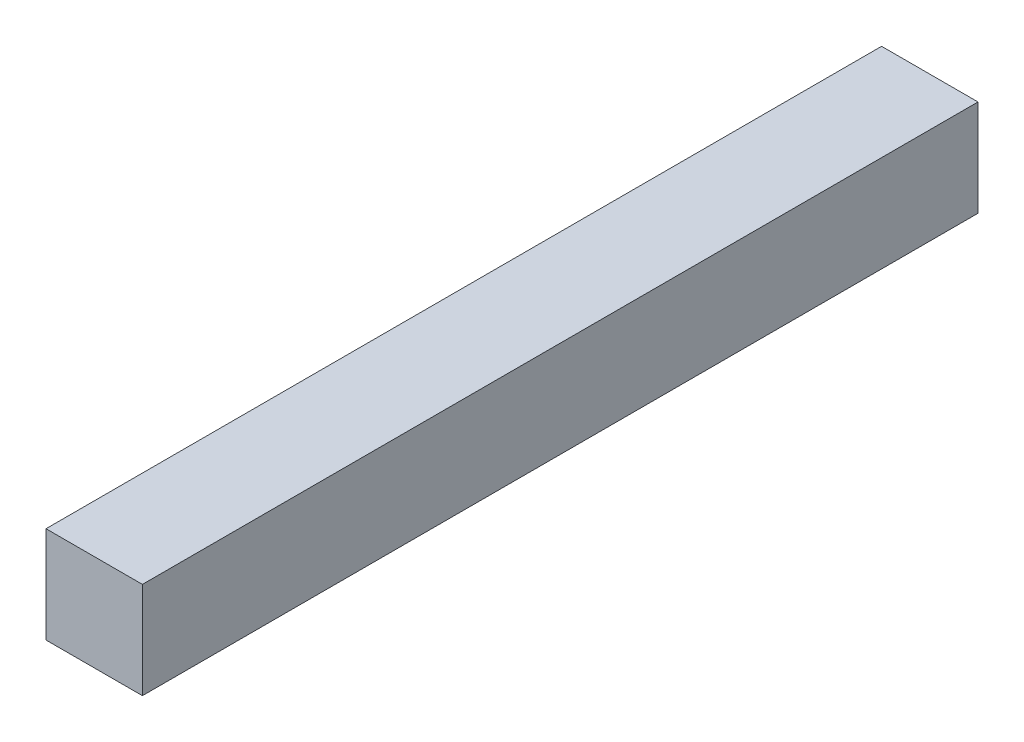
ISO-10303-21;
HEADER;
FILE_DESCRIPTION(('STEP AP214'),'2;1');
FILE_NAME('part.step','',(''),(''),'','','');
FILE_SCHEMA(('AUTOMOTIVE_DESIGN { 1 0 10303 214 1 1 1 1 }'));
ENDSEC;
DATA;
#1=APPLICATION_CONTEXT('core data for automotive mechanical design processes');
#2=APPLICATION_PROTOCOL_DEFINITION('international standard','automotive_design',2000,#1);
#3=PRODUCT_CONTEXT('',#1,'mechanical');
#4=PRODUCT('Part','Part','',(#3));
#5=PRODUCT_RELATED_PRODUCT_CATEGORY('part','',(#4));
#6=PRODUCT_DEFINITION_FORMATION('','',#4);
#7=PRODUCT_DEFINITION_CONTEXT('part definition',#1,'design');
#8=PRODUCT_DEFINITION('design','',#6,#7);
#9=PRODUCT_DEFINITION_SHAPE('','',#8);
#10=(LENGTH_UNIT() NAMED_UNIT(*) SI_UNIT(.MILLI.,.METRE.));
#11=(NAMED_UNIT(*) PLANE_ANGLE_UNIT() SI_UNIT($,.RADIAN.));
#12=(NAMED_UNIT(*) SI_UNIT($,.STERADIAN.) SOLID_ANGLE_UNIT());
#13=UNCERTAINTY_MEASURE_WITH_UNIT(LENGTH_MEASURE(1.E-05),#10,'distance_accuracy_value','');
#14=(GEOMETRIC_REPRESENTATION_CONTEXT(3) GLOBAL_UNCERTAINTY_ASSIGNED_CONTEXT((#13)) GLOBAL_UNIT_ASSIGNED_CONTEXT((#10,
#11,#12)) REPRESENTATION_CONTEXT('',''));
#15=CARTESIAN_POINT('',(0.,0.,0.));
#16=DIRECTION('',(0.,0.,1.));
#17=DIRECTION('',(1.,0.,0.));
#18=AXIS2_PLACEMENT_3D('',#15,#16,#17);
#19=CARTESIAN_POINT('',(-15.,15.,260.));
#20=DIRECTION('',(1.,0.,0.));
#21=DIRECTION('',(0.,0.,-1.));
#22=AXIS2_PLACEMENT_3D('',#19,#20,#21);
#23=PLANE('',#22);
#24=DIRECTION('',(0.,-1.,0.));
#25=VECTOR('',#24,1.);
#26=CARTESIAN_POINT('',(-15.,15.,0.));
#27=LINE('',#26,#25);
#28=CARTESIAN_POINT('',(-15.,15.,0.));
#29=VERTEX_POINT('',#28);
#30=CARTESIAN_POINT('',(-15.,-15.,0.));
#31=VERTEX_POINT('',#30);
#32=EDGE_CURVE('E97',#29,#31,#27,.T.);
#33=ORIENTED_EDGE('',*,*,#32,.T.);
#34=DIRECTION('',(0.,0.,-1.));
#35=VECTOR('',#34,1.);
#36=CARTESIAN_POINT('',(-15.,-15.,260.));
#37=LINE('',#36,#35);
#38=CARTESIAN_POINT('',(-15.,-15.,260.));
#39=VERTEX_POINT('',#38);
#40=EDGE_CURVE('E11',#39,#31,#37,.T.);
#41=ORIENTED_EDGE('',*,*,#40,.F.);
#42=DIRECTION('',(0.,-1.,0.));
#43=VECTOR('',#42,1.);
#44=CARTESIAN_POINT('',(-15.,15.,260.));
#45=LINE('',#44,#43);
#46=CARTESIAN_POINT('',(-15.,15.,260.));
#47=VERTEX_POINT('',#46);
#48=EDGE_CURVE('E85',#47,#39,#45,.T.);
#49=ORIENTED_EDGE('',*,*,#48,.F.);
#50=DIRECTION('',(0.,0.,-1.));
#51=VECTOR('',#50,1.);
#52=CARTESIAN_POINT('',(-15.,15.,260.));
#53=LINE('',#52,#51);
#54=EDGE_CURVE('E93',#47,#29,#53,.T.);
#55=ORIENTED_EDGE('',*,*,#54,.T.);
#56=EDGE_LOOP('',(#33,#41,#49,#55));
#57=FACE_BOUND('',#56,.T.);
#58=ADVANCED_FACE('F34',(#57),#23,.F.);
#59=CARTESIAN_POINT('',(15.,-15.,260.));
#60=DIRECTION('',(0.,1.,0.));
#61=DIRECTION('',(0.,0.,1.));
#62=AXIS2_PLACEMENT_3D('',#59,#60,#61);
#63=PLANE('',#62);
#64=DIRECTION('',(1.,0.,0.));
#65=VECTOR('',#64,1.);
#66=CARTESIAN_POINT('',(15.,-15.,0.));
#67=LINE('',#66,#65);
#68=CARTESIAN_POINT('',(15.,-15.,0.));
#69=VERTEX_POINT('',#68);
#70=EDGE_CURVE('E89',#31,#69,#67,.T.);
#71=ORIENTED_EDGE('',*,*,#70,.T.);
#72=DIRECTION('',(0.,0.,-1.));
#73=VECTOR('',#72,1.);
#74=CARTESIAN_POINT('',(15.,-15.,260.));
#75=LINE('',#74,#73);
#76=CARTESIAN_POINT('',(15.,-15.,260.));
#77=VERTEX_POINT('',#76);
#78=EDGE_CURVE('E42',#77,#69,#75,.T.);
#79=ORIENTED_EDGE('',*,*,#78,.F.);
#80=DIRECTION('',(1.,0.,0.));
#81=VECTOR('',#80,1.);
#82=CARTESIAN_POINT('',(15.,-15.,260.));
#83=LINE('',#82,#81);
#84=EDGE_CURVE('E80',#39,#77,#83,.T.);
#85=ORIENTED_EDGE('',*,*,#84,.F.);
#86=ORIENTED_EDGE('',*,*,#40,.T.);
#87=EDGE_LOOP('',(#71,#79,#85,#86));
#88=FACE_BOUND('',#87,.T.);
#89=ADVANCED_FACE('F88',(#88),#63,.F.);
#90=CARTESIAN_POINT('',(15.,15.,260.));
#91=DIRECTION('',(-1.,0.,0.));
#92=DIRECTION('',(0.,0.,1.));
#93=AXIS2_PLACEMENT_3D('',#90,#91,#92);
#94=PLANE('',#93);
#95=DIRECTION('',(0.,1.,0.));
#96=VECTOR('',#95,1.);
#97=CARTESIAN_POINT('',(15.,15.,0.));
#98=LINE('',#97,#96);
#99=CARTESIAN_POINT('',(15.,15.,0.));
#100=VERTEX_POINT('',#99);
#101=EDGE_CURVE('E67',#69,#100,#98,.T.);
#102=ORIENTED_EDGE('',*,*,#101,.T.);
#103=DIRECTION('',(0.,0.,-1.));
#104=VECTOR('',#103,1.);
#105=CARTESIAN_POINT('',(15.,15.,260.));
#106=LINE('',#105,#104);
#107=CARTESIAN_POINT('',(15.,15.,260.));
#108=VERTEX_POINT('',#107);
#109=EDGE_CURVE('E90',#108,#100,#106,.T.);
#110=ORIENTED_EDGE('',*,*,#109,.F.);
#111=DIRECTION('',(0.,1.,0.));
#112=VECTOR('',#111,1.);
#113=CARTESIAN_POINT('',(15.,15.,260.));
#114=LINE('',#113,#112);
#115=EDGE_CURVE('E83',#77,#108,#114,.T.);
#116=ORIENTED_EDGE('',*,*,#115,.F.);
#117=ORIENTED_EDGE('',*,*,#78,.T.);
#118=EDGE_LOOP('',(#102,#110,#116,#117));
#119=FACE_BOUND('',#118,.T.);
#120=ADVANCED_FACE('F91',(#119),#94,.F.);
#121=CARTESIAN_POINT('',(15.,15.,260.));
#122=DIRECTION('',(0.,-1.,0.));
#123=DIRECTION('',(0.,0.,-1.));
#124=AXIS2_PLACEMENT_3D('',#121,#122,#123);
#125=PLANE('',#124);
#126=DIRECTION('',(-1.,0.,0.));
#127=VECTOR('',#126,1.);
#128=CARTESIAN_POINT('',(15.,15.,0.));
#129=LINE('',#128,#127);
#130=EDGE_CURVE('E73',#100,#29,#129,.T.);
#131=ORIENTED_EDGE('',*,*,#130,.T.);
#132=ORIENTED_EDGE('',*,*,#54,.F.);
#133=DIRECTION('',(-1.,0.,0.));
#134=VECTOR('',#133,1.);
#135=CARTESIAN_POINT('',(15.,15.,260.));
#136=LINE('',#135,#134);
#137=EDGE_CURVE('E50',#108,#47,#136,.T.);
#138=ORIENTED_EDGE('',*,*,#137,.F.);
#139=ORIENTED_EDGE('',*,*,#109,.T.);
#140=EDGE_LOOP('',(#131,#132,#138,#139));
#141=FACE_BOUND('',#140,.T.);
#142=ADVANCED_FACE('F104',(#141),#125,.F.);
#143=CARTESIAN_POINT('',(0.,0.,260.));
#144=DIRECTION('',(0.,0.,-1.));
#145=DIRECTION('',(-1.,0.,0.));
#146=AXIS2_PLACEMENT_3D('',#143,#144,#145);
#147=PLANE('',#146);
#148=ORIENTED_EDGE('',*,*,#48,.T.);
#149=ORIENTED_EDGE('',*,*,#84,.T.);
#150=ORIENTED_EDGE('',*,*,#115,.T.);
#151=ORIENTED_EDGE('',*,*,#137,.T.);
#152=EDGE_LOOP('',(#148,#149,#150,#151));
#153=FACE_BOUND('',#152,.T.);
#154=ADVANCED_FACE('F81',(#153),#147,.F.);
#155=CARTESIAN_POINT('',(0.,0.,0.));
#156=DIRECTION('',(0.,0.,-1.));
#157=DIRECTION('',(-1.,0.,0.));
#158=AXIS2_PLACEMENT_3D('',#155,#156,#157);
#159=PLANE('',#158);
#160=ORIENTED_EDGE('',*,*,#32,.F.);
#161=ORIENTED_EDGE('',*,*,#130,.F.);
#162=ORIENTED_EDGE('',*,*,#101,.F.);
#163=ORIENTED_EDGE('',*,*,#70,.F.);
#164=EDGE_LOOP('',(#160,#161,#162,#163));
#165=FACE_BOUND('',#164,.T.);
#166=ADVANCED_FACE('F107',(#165),#159,.T.);
#167=CLOSED_SHELL('',(#58,#89,#120,#142,#154,#166));
#168=MANIFOLD_SOLID_BREP('B2',#167);
#169=ADVANCED_BREP_SHAPE_REPRESENTATION('',(#18,#168),#14);
#170=SHAPE_DEFINITION_REPRESENTATION(#9,#169);
ENDSEC;
END-ISO-10303-21;
